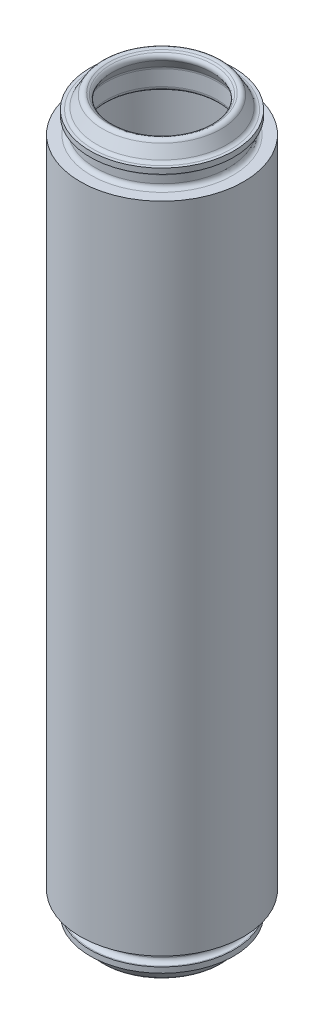
ISO-10303-21;
HEADER;
FILE_DESCRIPTION(('STEP AP214'),'2;1');
FILE_NAME('part.step','',(''),(''),'','','');
FILE_SCHEMA(('AUTOMOTIVE_DESIGN { 1 0 10303 214 1 1 1 1 }'));
ENDSEC;
DATA;
#1=APPLICATION_CONTEXT('core data for automotive mechanical design processes');
#2=APPLICATION_PROTOCOL_DEFINITION('international standard','automotive_design',2000,#1);
#3=PRODUCT_CONTEXT('',#1,'mechanical');
#4=PRODUCT('Part','Part','',(#3));
#5=PRODUCT_RELATED_PRODUCT_CATEGORY('part','',(#4));
#6=PRODUCT_DEFINITION_FORMATION('','',#4);
#7=PRODUCT_DEFINITION_CONTEXT('part definition',#1,'design');
#8=PRODUCT_DEFINITION('design','',#6,#7);
#9=PRODUCT_DEFINITION_SHAPE('','',#8);
#10=(LENGTH_UNIT() NAMED_UNIT(*) SI_UNIT(.MILLI.,.METRE.));
#11=(NAMED_UNIT(*) PLANE_ANGLE_UNIT() SI_UNIT($,.RADIAN.));
#12=(NAMED_UNIT(*) SI_UNIT($,.STERADIAN.) SOLID_ANGLE_UNIT());
#13=UNCERTAINTY_MEASURE_WITH_UNIT(LENGTH_MEASURE(1.E-05),#10,'distance_accuracy_value','');
#14=(GEOMETRIC_REPRESENTATION_CONTEXT(3) GLOBAL_UNCERTAINTY_ASSIGNED_CONTEXT((#13)) GLOBAL_UNIT_ASSIGNED_CONTEXT((#10,
#11,#12)) REPRESENTATION_CONTEXT('',''));
#15=CARTESIAN_POINT('',(0.,0.,0.));
#16=DIRECTION('',(0.,0.,1.));
#17=DIRECTION('',(1.,0.,0.));
#18=AXIS2_PLACEMENT_3D('',#15,#16,#17);
#19=CARTESIAN_POINT('',(0.,30.,0.));
#20=DIRECTION('',(0.,-1.,0.));
#21=DIRECTION('',(0.,0.,-1.));
#22=AXIS2_PLACEMENT_3D('',#19,#20,#21);
#23=CYLINDRICAL_SURFACE('',#22,7.5);
#24=CARTESIAN_POINT('',(0.,30.,0.));
#25=DIRECTION('',(0.,1.,0.));
#26=DIRECTION('',(0.,0.,1.));
#27=AXIS2_PLACEMENT_3D('',#24,#25,#26);
#28=CIRCLE('',#27,7.5);
#29=CARTESIAN_POINT('',(0.,30.,7.5));
#30=VERTEX_POINT('',#29);
#31=EDGE_CURVE('E50',#30,#30,#28,.T.);
#32=ORIENTED_EDGE('',*,*,#31,.F.);
#33=EDGE_LOOP('',(#32));
#34=FACE_BOUND('',#33,.T.);
#35=CARTESIAN_POINT('',(0.,-30.,0.));
#36=DIRECTION('',(0.,1.,0.));
#37=DIRECTION('',(0.,0.,1.));
#38=AXIS2_PLACEMENT_3D('',#35,#36,#37);
#39=CIRCLE('',#38,7.5);
#40=CARTESIAN_POINT('',(0.,-30.,7.5));
#41=VERTEX_POINT('',#40);
#42=EDGE_CURVE('E126',#41,#41,#39,.T.);
#43=ORIENTED_EDGE('',*,*,#42,.T.);
#44=EDGE_LOOP('',(#43));
#45=FACE_BOUND('',#44,.T.);
#46=ADVANCED_FACE('F43',(#34,#45),#23,.T.);
#47=CARTESIAN_POINT('',(0.,30.,0.));
#48=DIRECTION('',(0.,1.,0.));
#49=DIRECTION('',(0.,0.,1.));
#50=AXIS2_PLACEMENT_3D('',#47,#48,#49);
#51=PLANE('',#50);
#52=CARTESIAN_POINT('',(0.,30.,0.));
#53=DIRECTION('',(0.,1.,0.));
#54=DIRECTION('',(0.,0.,1.));
#55=AXIS2_PLACEMENT_3D('',#52,#53,#54);
#56=CIRCLE('',#55,6.5);
#57=CARTESIAN_POINT('',(0.,30.,6.5));
#58=VERTEX_POINT('',#57);
#59=EDGE_CURVE('E60',#58,#58,#56,.T.);
#60=ORIENTED_EDGE('',*,*,#59,.F.);
#61=EDGE_LOOP('',(#60));
#62=FACE_BOUND('',#61,.T.);
#63=ORIENTED_EDGE('',*,*,#31,.T.);
#64=EDGE_LOOP('',(#63));
#65=FACE_BOUND('',#64,.T.);
#66=ADVANCED_FACE('F215',(#62,#65),#51,.T.);
#67=CARTESIAN_POINT('',(0.,29.,0.));
#68=DIRECTION('',(0.,-1.,0.));
#69=DIRECTION('',(0.,0.,-1.));
#70=AXIS2_PLACEMENT_3D('',#67,#68,#69);
#71=CONICAL_SURFACE('',#70,6.5,0.950546840812074);
#72=CARTESIAN_POINT('',(0.,29.880353769634,0.));
#73=DIRECTION('',(0.,-1.,0.));
#74=DIRECTION('',(0.,0.,-1.));
#75=AXIS2_PLACEMENT_3D('',#72,#73,#74);
#76=CIRCLE('',#75,5.26750472251236);
#77=CARTESIAN_POINT('',(0.,29.880353769634,-5.26750472251236));
#78=VERTEX_POINT('',#77);
#79=EDGE_CURVE('E65',#78,#78,#76,.T.);
#80=ORIENTED_EDGE('',*,*,#79,.F.);
#81=EDGE_LOOP('',(#80));
#82=FACE_BOUND('',#81,.T.);
#83=CARTESIAN_POINT('',(0.,29.,0.));
#84=DIRECTION('',(0.,-1.,0.));
#85=DIRECTION('',(0.,0.,-1.));
#86=AXIS2_PLACEMENT_3D('',#83,#84,#85);
#87=CIRCLE('',#86,6.5);
#88=CARTESIAN_POINT('',(0.,29.,-6.5));
#89=VERTEX_POINT('',#88);
#90=EDGE_CURVE('E10',#89,#89,#87,.T.);
#91=ORIENTED_EDGE('',*,*,#90,.T.);
#92=EDGE_LOOP('',(#91));
#93=FACE_BOUND('',#92,.T.);
#94=ADVANCED_FACE('F221',(#82,#93),#71,.F.);
#95=CARTESIAN_POINT('',(0.,30.2058471581167,0.));
#96=DIRECTION('',(0.,-1.,0.));
#97=DIRECTION('',(0.,0.,-1.));
#98=AXIS2_PLACEMENT_3D('',#95,#96,#97);
#99=TOROIDAL_SURFACE('',#98,5.5,0.4);
#100=CARTESIAN_POINT('',(0.,30.2058471581167,0.));
#101=DIRECTION('',(0.,-1.,0.));
#102=DIRECTION('',(0.,0.,-1.));
#103=AXIS2_PLACEMENT_3D('',#100,#101,#102);
#104=CIRCLE('',#103,5.1);
#105=CARTESIAN_POINT('',(0.,30.2058471581167,-5.1));
#106=VERTEX_POINT('',#105);
#107=EDGE_CURVE('E70',#106,#106,#104,.T.);
#108=ORIENTED_EDGE('',*,*,#107,.F.);
#109=EDGE_LOOP('',(#108));
#110=FACE_BOUND('',#109,.T.);
#111=ORIENTED_EDGE('',*,*,#79,.T.);
#112=EDGE_LOOP('',(#111));
#113=FACE_BOUND('',#112,.T.);
#114=ADVANCED_FACE('F227',(#110,#113),#99,.T.);
#115=CARTESIAN_POINT('',(0.,21.5,0.));
#116=DIRECTION('',(0.,-1.,0.));
#117=DIRECTION('',(0.,0.,-1.));
#118=AXIS2_PLACEMENT_3D('',#115,#116,#117);
#119=CYLINDRICAL_SURFACE('',#118,5.1);
#120=CARTESIAN_POINT('',(0.,31.6248711305964,0.));
#121=DIRECTION('',(0.,-1.,0.));
#122=DIRECTION('',(0.,0.,-1.));
#123=AXIS2_PLACEMENT_3D('',#120,#121,#122);
#124=CIRCLE('',#123,5.1);
#125=CARTESIAN_POINT('',(0.,31.6248711305964,-5.1));
#126=VERTEX_POINT('',#125);
#127=EDGE_CURVE('E74',#126,#126,#124,.T.);
#128=ORIENTED_EDGE('',*,*,#127,.F.);
#129=EDGE_LOOP('',(#128));
#130=FACE_BOUND('',#129,.T.);
#131=ORIENTED_EDGE('',*,*,#107,.T.);
#132=EDGE_LOOP('',(#131));
#133=FACE_BOUND('',#132,.T.);
#134=ADVANCED_FACE('F240',(#130,#133),#119,.F.);
#135=CARTESIAN_POINT('',(0.,31.6248711305964,0.));
#136=DIRECTION('',(0.,-1.,0.));
#137=DIRECTION('',(0.,0.,-1.));
#138=AXIS2_PLACEMENT_3D('',#135,#136,#137);
#139=TOROIDAL_SURFACE('',#138,4.7,0.399999999999998);
#140=CARTESIAN_POINT('',(0.,31.8248711305964,0.));
#141=DIRECTION('',(0.,-1.,0.));
#142=DIRECTION('',(0.,0.,-1.));
#143=AXIS2_PLACEMENT_3D('',#140,#141,#142);
#144=CIRCLE('',#143,5.04641016151377);
#145=CARTESIAN_POINT('',(0.,31.8248711305964,-5.04641016151377));
#146=VERTEX_POINT('',#145);
#147=EDGE_CURVE('E78',#146,#146,#144,.T.);
#148=ORIENTED_EDGE('',*,*,#147,.F.);
#149=EDGE_LOOP('',(#148));
#150=FACE_BOUND('',#149,.T.);
#151=ORIENTED_EDGE('',*,*,#127,.T.);
#152=EDGE_LOOP('',(#151));
#153=FACE_BOUND('',#152,.T.);
#154=ADVANCED_FACE('F244',(#150,#153),#139,.F.);
#155=CARTESIAN_POINT('',(0.,31.8248711305964,0.));
#156=DIRECTION('',(0.,-1.,0.));
#157=DIRECTION('',(0.,0.,-1.));
#158=AXIS2_PLACEMENT_3D('',#155,#156,#157);
#159=CONICAL_SURFACE('',#158,5.04641016151377,0.523598775598291);
#160=CARTESIAN_POINT('',(0.,32.6535898384862,0.));
#161=DIRECTION('',(0.,-1.,0.));
#162=DIRECTION('',(0.,0.,-1.));
#163=AXIS2_PLACEMENT_3D('',#160,#161,#162);
#164=CIRCLE('',#163,4.56794919243113);
#165=CARTESIAN_POINT('',(0.,32.6535898384862,-4.56794919243113));
#166=VERTEX_POINT('',#165);
#167=EDGE_CURVE('E82',#166,#166,#164,.T.);
#168=ORIENTED_EDGE('',*,*,#167,.F.);
#169=EDGE_LOOP('',(#168));
#170=FACE_BOUND('',#169,.T.);
#171=ORIENTED_EDGE('',*,*,#147,.T.);
#172=EDGE_LOOP('',(#171));
#173=FACE_BOUND('',#172,.T.);
#174=ADVANCED_FACE('F248',(#170,#173),#159,.F.);
#175=CARTESIAN_POINT('',(0.,32.8535898384862,0.));
#176=DIRECTION('',(0.,-1.,0.));
#177=DIRECTION('',(0.,0.,-1.));
#178=AXIS2_PLACEMENT_3D('',#175,#176,#177);
#179=TOROIDAL_SURFACE('',#178,4.9143593539449,0.399999999999999);
#180=CARTESIAN_POINT('',(0.,33.2,0.));
#181=DIRECTION('',(0.,-1.,0.));
#182=DIRECTION('',(0.,0.,-1.));
#183=AXIS2_PLACEMENT_3D('',#180,#181,#182);
#184=CIRCLE('',#183,4.71435935394491);
#185=CARTESIAN_POINT('',(0.,33.2,-4.71435935394491));
#186=VERTEX_POINT('',#185);
#187=EDGE_CURVE('E86',#186,#186,#184,.T.);
#188=ORIENTED_EDGE('',*,*,#187,.F.);
#189=EDGE_LOOP('',(#188));
#190=FACE_BOUND('',#189,.T.);
#191=ORIENTED_EDGE('',*,*,#167,.T.);
#192=EDGE_LOOP('',(#191));
#193=FACE_BOUND('',#192,.T.);
#194=ADVANCED_FACE('F252',(#190,#193),#179,.T.);
#195=CARTESIAN_POINT('',(0.,33.2,0.));
#196=DIRECTION('',(0.,1.,0.));
#197=DIRECTION('',(0.,0.,1.));
#198=AXIS2_PLACEMENT_3D('',#195,#196,#197);
#199=CONICAL_SURFACE('',#198,4.71435935394491,1.04719755119661);
#200=CARTESIAN_POINT('',(0.,33.3,0.));
#201=DIRECTION('',(0.,-1.,0.));
#202=DIRECTION('',(0.,0.,-1.));
#203=AXIS2_PLACEMENT_3D('',#200,#201,#202);
#204=CIRCLE('',#203,4.88756443470179);
#205=CARTESIAN_POINT('',(0.,33.3,-4.88756443470179));
#206=VERTEX_POINT('',#205);
#207=EDGE_CURVE('E90',#206,#206,#204,.T.);
#208=ORIENTED_EDGE('',*,*,#207,.F.);
#209=EDGE_LOOP('',(#208));
#210=FACE_BOUND('',#209,.T.);
#211=ORIENTED_EDGE('',*,*,#187,.T.);
#212=EDGE_LOOP('',(#211));
#213=FACE_BOUND('',#212,.T.);
#214=ADVANCED_FACE('F256',(#210,#213),#199,.F.);
#215=CARTESIAN_POINT('',(0.,32.9535898384862,0.));
#216=DIRECTION('',(0.,-1.,0.));
#217=DIRECTION('',(0.,0.,-1.));
#218=AXIS2_PLACEMENT_3D('',#215,#216,#217);
#219=TOROIDAL_SURFACE('',#218,5.08756443470179,0.399999999999998);
#220=CARTESIAN_POINT('',(0.,33.1535898384862,0.));
#221=DIRECTION('',(0.,-1.,0.));
#222=DIRECTION('',(0.,0.,-1.));
#223=AXIS2_PLACEMENT_3D('',#220,#221,#222);
#224=CIRCLE('',#223,5.43397459621557);
#225=CARTESIAN_POINT('',(0.,33.1535898384862,-5.43397459621557));
#226=VERTEX_POINT('',#225);
#227=EDGE_CURVE('E94',#226,#226,#224,.T.);
#228=ORIENTED_EDGE('',*,*,#227,.F.);
#229=EDGE_LOOP('',(#228));
#230=FACE_BOUND('',#229,.T.);
#231=ORIENTED_EDGE('',*,*,#207,.T.);
#232=EDGE_LOOP('',(#231));
#233=FACE_BOUND('',#232,.T.);
#234=ADVANCED_FACE('F260',(#230,#233),#219,.T.);
#235=CARTESIAN_POINT('',(0.,33.1535898384862,0.));
#236=DIRECTION('',(0.,-1.,0.));
#237=DIRECTION('',(0.,0.,-1.));
#238=AXIS2_PLACEMENT_3D('',#235,#236,#237);
#239=CONICAL_SURFACE('',#238,5.43397459621557,0.523598775598298);
#240=CARTESIAN_POINT('',(0.,32.2,0.));
#241=DIRECTION('',(0.,-1.,0.));
#242=DIRECTION('',(0.,0.,-1.));
#243=AXIS2_PLACEMENT_3D('',#240,#241,#242);
#244=CIRCLE('',#243,5.98452994616208);
#245=CARTESIAN_POINT('',(0.,32.2,-5.98452994616208));
#246=VERTEX_POINT('',#245);
#247=EDGE_CURVE('E98',#246,#246,#244,.T.);
#248=ORIENTED_EDGE('',*,*,#247,.F.);
#249=EDGE_LOOP('',(#248));
#250=FACE_BOUND('',#249,.T.);
#251=ORIENTED_EDGE('',*,*,#227,.T.);
#252=EDGE_LOOP('',(#251));
#253=FACE_BOUND('',#252,.T.);
#254=ADVANCED_FACE('F264',(#250,#253),#239,.T.);
#255=CARTESIAN_POINT('',(0.,32.4,0.));
#256=DIRECTION('',(0.,-1.,0.));
#257=DIRECTION('',(0.,0.,-1.));
#258=AXIS2_PLACEMENT_3D('',#255,#256,#257);
#259=TOROIDAL_SURFACE('',#258,6.33094010767586,0.399999999999998);
#260=CARTESIAN_POINT('',(0.,32.,0.));
#261=DIRECTION('',(0.,-1.,0.));
#262=DIRECTION('',(0.,0.,-1.));
#263=AXIS2_PLACEMENT_3D('',#260,#261,#262);
#264=CIRCLE('',#263,6.33094010767586);
#265=CARTESIAN_POINT('',(0.,32.,-6.33094010767586));
#266=VERTEX_POINT('',#265);
#267=EDGE_CURVE('E102',#266,#266,#264,.T.);
#268=ORIENTED_EDGE('',*,*,#267,.F.);
#269=EDGE_LOOP('',(#268));
#270=FACE_BOUND('',#269,.T.);
#271=ORIENTED_EDGE('',*,*,#247,.T.);
#272=EDGE_LOOP('',(#271));
#273=FACE_BOUND('',#272,.T.);
#274=ADVANCED_FACE('F268',(#270,#273),#259,.F.);
#275=CARTESIAN_POINT('',(-6.6,32.,0.));
#276=DIRECTION('',(0.,-1.,0.));
#277=DIRECTION('',(0.,0.,-1.));
#278=AXIS2_PLACEMENT_3D('',#275,#276,#277);
#279=PLANE('',#278);
#280=CARTESIAN_POINT('',(0.,32.,0.));
#281=DIRECTION('',(0.,-1.,0.));
#282=DIRECTION('',(0.,0.,-1.));
#283=AXIS2_PLACEMENT_3D('',#280,#281,#282);
#284=CIRCLE('',#283,6.6);
#285=CARTESIAN_POINT('',(0.,32.,-6.6));
#286=VERTEX_POINT('',#285);
#287=EDGE_CURVE('E106',#286,#286,#284,.T.);
#288=ORIENTED_EDGE('',*,*,#287,.F.);
#289=EDGE_LOOP('',(#288));
#290=FACE_BOUND('',#289,.T.);
#291=ORIENTED_EDGE('',*,*,#267,.T.);
#292=EDGE_LOOP('',(#291));
#293=FACE_BOUND('',#292,.T.);
#294=ADVANCED_FACE('F272',(#290,#293),#279,.F.);
#295=CARTESIAN_POINT('',(0.,21.5,0.));
#296=DIRECTION('',(0.,-1.,0.));
#297=DIRECTION('',(0.,0.,-1.));
#298=AXIS2_PLACEMENT_3D('',#295,#296,#297);
#299=CYLINDRICAL_SURFACE('',#298,6.6);
#300=CARTESIAN_POINT('',(0.,31.5,0.));
#301=DIRECTION('',(0.,-1.,0.));
#302=DIRECTION('',(0.,0.,-1.));
#303=AXIS2_PLACEMENT_3D('',#300,#301,#302);
#304=CIRCLE('',#303,6.6);
#305=CARTESIAN_POINT('',(0.,31.5,-6.6));
#306=VERTEX_POINT('',#305);
#307=EDGE_CURVE('E110',#306,#306,#304,.T.);
#308=ORIENTED_EDGE('',*,*,#307,.F.);
#309=EDGE_LOOP('',(#308));
#310=FACE_BOUND('',#309,.T.);
#311=ORIENTED_EDGE('',*,*,#287,.T.);
#312=EDGE_LOOP('',(#311));
#313=FACE_BOUND('',#312,.T.);
#314=ADVANCED_FACE('F276',(#310,#313),#299,.T.);
#315=CARTESIAN_POINT('',(-6.5,31.5,0.));
#316=DIRECTION('',(0.,1.,0.));
#317=DIRECTION('',(0.,0.,1.));
#318=AXIS2_PLACEMENT_3D('',#315,#316,#317);
#319=PLANE('',#318);
#320=CARTESIAN_POINT('',(0.,31.5,0.));
#321=DIRECTION('',(0.,-1.,0.));
#322=DIRECTION('',(0.,0.,-1.));
#323=AXIS2_PLACEMENT_3D('',#320,#321,#322);
#324=CIRCLE('',#323,6.5);
#325=CARTESIAN_POINT('',(0.,31.5,-6.5));
#326=VERTEX_POINT('',#325);
#327=EDGE_CURVE('E114',#326,#326,#324,.T.);
#328=ORIENTED_EDGE('',*,*,#327,.F.);
#329=EDGE_LOOP('',(#328));
#330=FACE_BOUND('',#329,.T.);
#331=ORIENTED_EDGE('',*,*,#307,.T.);
#332=EDGE_LOOP('',(#331));
#333=FACE_BOUND('',#332,.T.);
#334=ADVANCED_FACE('F280',(#330,#333),#319,.F.);
#335=CARTESIAN_POINT('',(0.,31.1,0.));
#336=DIRECTION('',(0.,-1.,0.));
#337=DIRECTION('',(0.,0.,-1.));
#338=AXIS2_PLACEMENT_3D('',#335,#336,#337);
#339=TOROIDAL_SURFACE('',#338,6.5,0.400000000000001);
#340=CARTESIAN_POINT('',(0.,31.1,0.));
#341=DIRECTION('',(0.,-1.,0.));
#342=DIRECTION('',(0.,0.,-1.));
#343=AXIS2_PLACEMENT_3D('',#340,#341,#342);
#344=CIRCLE('',#343,6.1);
#345=CARTESIAN_POINT('',(0.,31.1,-6.1));
#346=VERTEX_POINT('',#345);
#347=EDGE_CURVE('E118',#346,#346,#344,.T.);
#348=ORIENTED_EDGE('',*,*,#347,.F.);
#349=EDGE_LOOP('',(#348));
#350=FACE_BOUND('',#349,.T.);
#351=ORIENTED_EDGE('',*,*,#327,.T.);
#352=EDGE_LOOP('',(#351));
#353=FACE_BOUND('',#352,.T.);
#354=ADVANCED_FACE('F284',(#350,#353),#339,.F.);
#355=CARTESIAN_POINT('',(0.,21.5,0.));
#356=DIRECTION('',(0.,-1.,0.));
#357=DIRECTION('',(0.,0.,-1.));
#358=AXIS2_PLACEMENT_3D('',#355,#356,#357);
#359=CYLINDRICAL_SURFACE('',#358,6.1);
#360=CARTESIAN_POINT('',(0.,30.4,0.));
#361=DIRECTION('',(0.,-1.,0.));
#362=DIRECTION('',(0.,0.,-1.));
#363=AXIS2_PLACEMENT_3D('',#360,#361,#362);
#364=CIRCLE('',#363,6.1);
#365=CARTESIAN_POINT('',(0.,30.4,-6.1));
#366=VERTEX_POINT('',#365);
#367=EDGE_CURVE('E122',#366,#366,#364,.T.);
#368=ORIENTED_EDGE('',*,*,#367,.F.);
#369=EDGE_LOOP('',(#368));
#370=FACE_BOUND('',#369,.T.);
#371=ORIENTED_EDGE('',*,*,#347,.T.);
#372=EDGE_LOOP('',(#371));
#373=FACE_BOUND('',#372,.T.);
#374=ADVANCED_FACE('F288',(#370,#373),#359,.T.);
#375=CARTESIAN_POINT('',(0.,30.4,0.));
#376=DIRECTION('',(0.,-1.,0.));
#377=DIRECTION('',(0.,0.,-1.));
#378=AXIS2_PLACEMENT_3D('',#375,#376,#377);
#379=TOROIDAL_SURFACE('',#378,6.5,0.400000000000001);
#380=ORIENTED_EDGE('',*,*,#59,.T.);
#381=EDGE_LOOP('',(#380));
#382=FACE_BOUND('',#381,.T.);
#383=ORIENTED_EDGE('',*,*,#367,.T.);
#384=EDGE_LOOP('',(#383));
#385=FACE_BOUND('',#384,.T.);
#386=ADVANCED_FACE('F235',(#382,#385),#379,.F.);
#387=CARTESIAN_POINT('',(0.,21.5,0.));
#388=DIRECTION('',(0.,1.,0.));
#389=DIRECTION('',(0.,0.,1.));
#390=AXIS2_PLACEMENT_3D('',#387,#388,#389);
#391=PLANE('',#390);
#392=CARTESIAN_POINT('',(0.,21.5,0.));
#393=DIRECTION('',(0.,1.,0.));
#394=DIRECTION('',(0.,0.,1.));
#395=AXIS2_PLACEMENT_3D('',#392,#393,#394);
#396=CIRCLE('',#395,6.5);
#397=CARTESIAN_POINT('',(0.,21.5,6.5));
#398=VERTEX_POINT('',#397);
#399=EDGE_CURVE('E55',#398,#398,#396,.T.);
#400=ORIENTED_EDGE('',*,*,#399,.T.);
#401=EDGE_LOOP('',(#400));
#402=FACE_BOUND('',#401,.T.);
#403=ADVANCED_FACE('F233',(#402),#391,.T.);
#404=CARTESIAN_POINT('',(0.,21.5,0.));
#405=DIRECTION('',(0.,1.,0.));
#406=DIRECTION('',(0.,0.,1.));
#407=AXIS2_PLACEMENT_3D('',#404,#405,#406);
#408=CYLINDRICAL_SURFACE('',#407,6.5);
#409=ORIENTED_EDGE('',*,*,#399,.F.);
#410=EDGE_LOOP('',(#409));
#411=FACE_BOUND('',#410,.T.);
#412=ORIENTED_EDGE('',*,*,#90,.F.);
#413=EDGE_LOOP('',(#412));
#414=FACE_BOUND('',#413,.T.);
#415=ADVANCED_FACE('F210',(#411,#414),#408,.F.);
#416=CARTESIAN_POINT('',(0.,-30.,0.));
#417=DIRECTION('',(0.,-1.,0.));
#418=DIRECTION('',(0.,0.,1.));
#419=AXIS2_PLACEMENT_3D('',#416,#417,#418);
#420=PLANE('',#419);
#421=CARTESIAN_POINT('',(0.,-30.,0.));
#422=DIRECTION('',(0.,-1.,0.));
#423=DIRECTION('',(0.,0.,-1.));
#424=AXIS2_PLACEMENT_3D('',#421,#422,#423);
#425=CIRCLE('',#424,6.5);
#426=CARTESIAN_POINT('',(0.,-30.,-6.5));
#427=VERTEX_POINT('',#426);
#428=EDGE_CURVE('E198',#427,#427,#425,.T.);
#429=ORIENTED_EDGE('',*,*,#428,.F.);
#430=EDGE_LOOP('',(#429));
#431=FACE_BOUND('',#430,.T.);
#432=ORIENTED_EDGE('',*,*,#42,.F.);
#433=EDGE_LOOP('',(#432));
#434=FACE_BOUND('',#433,.T.);
#435=ADVANCED_FACE('F206',(#431,#434),#420,.T.);
#436=CARTESIAN_POINT('',(0.,-29.,0.));
#437=DIRECTION('',(0.,1.,0.));
#438=DIRECTION('',(0.,0.,-1.));
#439=AXIS2_PLACEMENT_3D('',#436,#437,#438);
#440=CONICAL_SURFACE('',#439,6.5,0.950546840812074);
#441=CARTESIAN_POINT('',(0.,-29.880353769634,0.));
#442=DIRECTION('',(0.,-1.,0.));
#443=DIRECTION('',(0.,0.,-1.));
#444=AXIS2_PLACEMENT_3D('',#441,#442,#443);
#445=CIRCLE('',#444,5.26750472251236);
#446=CARTESIAN_POINT('',(0.,-29.880353769634,-5.26750472251236));
#447=VERTEX_POINT('',#446);
#448=EDGE_CURVE('E138',#447,#447,#445,.T.);
#449=ORIENTED_EDGE('',*,*,#448,.T.);
#450=EDGE_LOOP('',(#449));
#451=FACE_BOUND('',#450,.T.);
#452=CARTESIAN_POINT('',(0.,-29.,0.));
#453=DIRECTION('',(0.,-1.,0.));
#454=DIRECTION('',(0.,0.,-1.));
#455=AXIS2_PLACEMENT_3D('',#452,#453,#454);
#456=CIRCLE('',#455,6.5);
#457=CARTESIAN_POINT('',(0.,-29.,-6.5));
#458=VERTEX_POINT('',#457);
#459=EDGE_CURVE('E134',#458,#458,#456,.T.);
#460=ORIENTED_EDGE('',*,*,#459,.F.);
#461=EDGE_LOOP('',(#460));
#462=FACE_BOUND('',#461,.T.);
#463=ADVANCED_FACE('F209',(#451,#462),#440,.F.);
#464=CARTESIAN_POINT('',(0.,-30.2058471581167,0.));
#465=DIRECTION('',(0.,1.,0.));
#466=DIRECTION('',(0.,0.,-1.));
#467=AXIS2_PLACEMENT_3D('',#464,#465,#466);
#468=TOROIDAL_SURFACE('',#467,5.5,0.4);
#469=CARTESIAN_POINT('',(0.,-30.2058471581167,0.));
#470=DIRECTION('',(0.,-1.,0.));
#471=DIRECTION('',(0.,0.,-1.));
#472=AXIS2_PLACEMENT_3D('',#469,#470,#471);
#473=CIRCLE('',#472,5.1);
#474=CARTESIAN_POINT('',(0.,-30.2058471581167,-5.1));
#475=VERTEX_POINT('',#474);
#476=EDGE_CURVE('E142',#475,#475,#473,.T.);
#477=ORIENTED_EDGE('',*,*,#476,.T.);
#478=EDGE_LOOP('',(#477));
#479=FACE_BOUND('',#478,.T.);
#480=ORIENTED_EDGE('',*,*,#448,.F.);
#481=EDGE_LOOP('',(#480));
#482=FACE_BOUND('',#481,.T.);
#483=ADVANCED_FACE('F306',(#479,#482),#468,.T.);
#484=CARTESIAN_POINT('',(0.,-21.5,0.));
#485=DIRECTION('',(0.,1.,0.));
#486=DIRECTION('',(0.,0.,-1.));
#487=AXIS2_PLACEMENT_3D('',#484,#485,#486);
#488=CYLINDRICAL_SURFACE('',#487,5.1);
#489=CARTESIAN_POINT('',(0.,-31.6248711305964,0.));
#490=DIRECTION('',(0.,-1.,0.));
#491=DIRECTION('',(0.,0.,-1.));
#492=AXIS2_PLACEMENT_3D('',#489,#490,#491);
#493=CIRCLE('',#492,5.1);
#494=CARTESIAN_POINT('',(0.,-31.6248711305964,-5.1));
#495=VERTEX_POINT('',#494);
#496=EDGE_CURVE('E146',#495,#495,#493,.T.);
#497=ORIENTED_EDGE('',*,*,#496,.T.);
#498=EDGE_LOOP('',(#497));
#499=FACE_BOUND('',#498,.T.);
#500=ORIENTED_EDGE('',*,*,#476,.F.);
#501=EDGE_LOOP('',(#500));
#502=FACE_BOUND('',#501,.T.);
#503=ADVANCED_FACE('F310',(#499,#502),#488,.F.);
#504=CARTESIAN_POINT('',(0.,-31.6248711305964,0.));
#505=DIRECTION('',(0.,1.,0.));
#506=DIRECTION('',(0.,0.,-1.));
#507=AXIS2_PLACEMENT_3D('',#504,#505,#506);
#508=TOROIDAL_SURFACE('',#507,4.7,0.399999999999998);
#509=CARTESIAN_POINT('',(0.,-31.8248711305964,0.));
#510=DIRECTION('',(0.,-1.,0.));
#511=DIRECTION('',(0.,0.,-1.));
#512=AXIS2_PLACEMENT_3D('',#509,#510,#511);
#513=CIRCLE('',#512,5.04641016151377);
#514=CARTESIAN_POINT('',(0.,-31.8248711305964,-5.04641016151377));
#515=VERTEX_POINT('',#514);
#516=EDGE_CURVE('E150',#515,#515,#513,.T.);
#517=ORIENTED_EDGE('',*,*,#516,.T.);
#518=EDGE_LOOP('',(#517));
#519=FACE_BOUND('',#518,.T.);
#520=ORIENTED_EDGE('',*,*,#496,.F.);
#521=EDGE_LOOP('',(#520));
#522=FACE_BOUND('',#521,.T.);
#523=ADVANCED_FACE('F314',(#519,#522),#508,.F.);
#524=CARTESIAN_POINT('',(0.,-31.8248711305964,0.));
#525=DIRECTION('',(0.,1.,0.));
#526=DIRECTION('',(0.,0.,-1.));
#527=AXIS2_PLACEMENT_3D('',#524,#525,#526);
#528=CONICAL_SURFACE('',#527,5.04641016151377,0.523598775598291);
#529=CARTESIAN_POINT('',(0.,-32.6535898384862,0.));
#530=DIRECTION('',(0.,-1.,0.));
#531=DIRECTION('',(0.,0.,-1.));
#532=AXIS2_PLACEMENT_3D('',#529,#530,#531);
#533=CIRCLE('',#532,4.56794919243113);
#534=CARTESIAN_POINT('',(0.,-32.6535898384862,-4.56794919243113));
#535=VERTEX_POINT('',#534);
#536=EDGE_CURVE('E154',#535,#535,#533,.T.);
#537=ORIENTED_EDGE('',*,*,#536,.T.);
#538=EDGE_LOOP('',(#537));
#539=FACE_BOUND('',#538,.T.);
#540=ORIENTED_EDGE('',*,*,#516,.F.);
#541=EDGE_LOOP('',(#540));
#542=FACE_BOUND('',#541,.T.);
#543=ADVANCED_FACE('F318',(#539,#542),#528,.F.);
#544=CARTESIAN_POINT('',(0.,-32.8535898384862,0.));
#545=DIRECTION('',(0.,1.,0.));
#546=DIRECTION('',(0.,0.,-1.));
#547=AXIS2_PLACEMENT_3D('',#544,#545,#546);
#548=TOROIDAL_SURFACE('',#547,4.9143593539449,0.399999999999999);
#549=CARTESIAN_POINT('',(0.,-33.2,0.));
#550=DIRECTION('',(0.,-1.,0.));
#551=DIRECTION('',(0.,0.,-1.));
#552=AXIS2_PLACEMENT_3D('',#549,#550,#551);
#553=CIRCLE('',#552,4.71435935394491);
#554=CARTESIAN_POINT('',(0.,-33.2,-4.71435935394491));
#555=VERTEX_POINT('',#554);
#556=EDGE_CURVE('E158',#555,#555,#553,.T.);
#557=ORIENTED_EDGE('',*,*,#556,.T.);
#558=EDGE_LOOP('',(#557));
#559=FACE_BOUND('',#558,.T.);
#560=ORIENTED_EDGE('',*,*,#536,.F.);
#561=EDGE_LOOP('',(#560));
#562=FACE_BOUND('',#561,.T.);
#563=ADVANCED_FACE('F322',(#559,#562),#548,.T.);
#564=CARTESIAN_POINT('',(0.,-33.2,0.));
#565=DIRECTION('',(0.,-1.,0.));
#566=DIRECTION('',(0.,0.,1.));
#567=AXIS2_PLACEMENT_3D('',#564,#565,#566);
#568=CONICAL_SURFACE('',#567,4.71435935394491,1.04719755119661);
#569=CARTESIAN_POINT('',(0.,-33.3,0.));
#570=DIRECTION('',(0.,-1.,0.));
#571=DIRECTION('',(0.,0.,-1.));
#572=AXIS2_PLACEMENT_3D('',#569,#570,#571);
#573=CIRCLE('',#572,4.88756443470179);
#574=CARTESIAN_POINT('',(0.,-33.3,-4.88756443470179));
#575=VERTEX_POINT('',#574);
#576=EDGE_CURVE('E162',#575,#575,#573,.T.);
#577=ORIENTED_EDGE('',*,*,#576,.T.);
#578=EDGE_LOOP('',(#577));
#579=FACE_BOUND('',#578,.T.);
#580=ORIENTED_EDGE('',*,*,#556,.F.);
#581=EDGE_LOOP('',(#580));
#582=FACE_BOUND('',#581,.T.);
#583=ADVANCED_FACE('F326',(#579,#582),#568,.F.);
#584=CARTESIAN_POINT('',(0.,-32.9535898384862,0.));
#585=DIRECTION('',(0.,1.,0.));
#586=DIRECTION('',(0.,0.,-1.));
#587=AXIS2_PLACEMENT_3D('',#584,#585,#586);
#588=TOROIDAL_SURFACE('',#587,5.08756443470179,0.399999999999998);
#589=CARTESIAN_POINT('',(0.,-33.1535898384862,0.));
#590=DIRECTION('',(0.,-1.,0.));
#591=DIRECTION('',(0.,0.,-1.));
#592=AXIS2_PLACEMENT_3D('',#589,#590,#591);
#593=CIRCLE('',#592,5.43397459621557);
#594=CARTESIAN_POINT('',(0.,-33.1535898384862,-5.43397459621557));
#595=VERTEX_POINT('',#594);
#596=EDGE_CURVE('E166',#595,#595,#593,.T.);
#597=ORIENTED_EDGE('',*,*,#596,.T.);
#598=EDGE_LOOP('',(#597));
#599=FACE_BOUND('',#598,.T.);
#600=ORIENTED_EDGE('',*,*,#576,.F.);
#601=EDGE_LOOP('',(#600));
#602=FACE_BOUND('',#601,.T.);
#603=ADVANCED_FACE('F330',(#599,#602),#588,.T.);
#604=CARTESIAN_POINT('',(0.,-33.1535898384862,0.));
#605=DIRECTION('',(0.,1.,0.));
#606=DIRECTION('',(0.,0.,-1.));
#607=AXIS2_PLACEMENT_3D('',#604,#605,#606);
#608=CONICAL_SURFACE('',#607,5.43397459621557,0.523598775598298);
#609=CARTESIAN_POINT('',(0.,-32.2,0.));
#610=DIRECTION('',(0.,-1.,0.));
#611=DIRECTION('',(0.,0.,-1.));
#612=AXIS2_PLACEMENT_3D('',#609,#610,#611);
#613=CIRCLE('',#612,5.98452994616208);
#614=CARTESIAN_POINT('',(0.,-32.2,-5.98452994616208));
#615=VERTEX_POINT('',#614);
#616=EDGE_CURVE('E170',#615,#615,#613,.T.);
#617=ORIENTED_EDGE('',*,*,#616,.T.);
#618=EDGE_LOOP('',(#617));
#619=FACE_BOUND('',#618,.T.);
#620=ORIENTED_EDGE('',*,*,#596,.F.);
#621=EDGE_LOOP('',(#620));
#622=FACE_BOUND('',#621,.T.);
#623=ADVANCED_FACE('F334',(#619,#622),#608,.T.);
#624=CARTESIAN_POINT('',(0.,-32.4,0.));
#625=DIRECTION('',(0.,1.,0.));
#626=DIRECTION('',(0.,0.,-1.));
#627=AXIS2_PLACEMENT_3D('',#624,#625,#626);
#628=TOROIDAL_SURFACE('',#627,6.33094010767586,0.399999999999998);
#629=CARTESIAN_POINT('',(0.,-32.,0.));
#630=DIRECTION('',(0.,-1.,0.));
#631=DIRECTION('',(0.,0.,-1.));
#632=AXIS2_PLACEMENT_3D('',#629,#630,#631);
#633=CIRCLE('',#632,6.33094010767586);
#634=CARTESIAN_POINT('',(0.,-32.,-6.33094010767586));
#635=VERTEX_POINT('',#634);
#636=EDGE_CURVE('E174',#635,#635,#633,.T.);
#637=ORIENTED_EDGE('',*,*,#636,.T.);
#638=EDGE_LOOP('',(#637));
#639=FACE_BOUND('',#638,.T.);
#640=ORIENTED_EDGE('',*,*,#616,.F.);
#641=EDGE_LOOP('',(#640));
#642=FACE_BOUND('',#641,.T.);
#643=ADVANCED_FACE('F338',(#639,#642),#628,.F.);
#644=CARTESIAN_POINT('',(-6.6,-32.,0.));
#645=DIRECTION('',(0.,1.,0.));
#646=DIRECTION('',(0.,0.,-1.));
#647=AXIS2_PLACEMENT_3D('',#644,#645,#646);
#648=PLANE('',#647);
#649=CARTESIAN_POINT('',(0.,-32.,0.));
#650=DIRECTION('',(0.,-1.,0.));
#651=DIRECTION('',(0.,0.,-1.));
#652=AXIS2_PLACEMENT_3D('',#649,#650,#651);
#653=CIRCLE('',#652,6.6);
#654=CARTESIAN_POINT('',(0.,-32.,-6.6));
#655=VERTEX_POINT('',#654);
#656=EDGE_CURVE('E178',#655,#655,#653,.T.);
#657=ORIENTED_EDGE('',*,*,#656,.T.);
#658=EDGE_LOOP('',(#657));
#659=FACE_BOUND('',#658,.T.);
#660=ORIENTED_EDGE('',*,*,#636,.F.);
#661=EDGE_LOOP('',(#660));
#662=FACE_BOUND('',#661,.T.);
#663=ADVANCED_FACE('F342',(#659,#662),#648,.F.);
#664=CARTESIAN_POINT('',(0.,-21.5,0.));
#665=DIRECTION('',(0.,1.,0.));
#666=DIRECTION('',(0.,0.,-1.));
#667=AXIS2_PLACEMENT_3D('',#664,#665,#666);
#668=CYLINDRICAL_SURFACE('',#667,6.6);
#669=CARTESIAN_POINT('',(0.,-31.5,0.));
#670=DIRECTION('',(0.,-1.,0.));
#671=DIRECTION('',(0.,0.,-1.));
#672=AXIS2_PLACEMENT_3D('',#669,#670,#671);
#673=CIRCLE('',#672,6.6);
#674=CARTESIAN_POINT('',(0.,-31.5,-6.6));
#675=VERTEX_POINT('',#674);
#676=EDGE_CURVE('E182',#675,#675,#673,.T.);
#677=ORIENTED_EDGE('',*,*,#676,.T.);
#678=EDGE_LOOP('',(#677));
#679=FACE_BOUND('',#678,.T.);
#680=ORIENTED_EDGE('',*,*,#656,.F.);
#681=EDGE_LOOP('',(#680));
#682=FACE_BOUND('',#681,.T.);
#683=ADVANCED_FACE('F346',(#679,#682),#668,.T.);
#684=CARTESIAN_POINT('',(-6.5,-31.5,0.));
#685=DIRECTION('',(0.,-1.,0.));
#686=DIRECTION('',(0.,0.,1.));
#687=AXIS2_PLACEMENT_3D('',#684,#685,#686);
#688=PLANE('',#687);
#689=CARTESIAN_POINT('',(0.,-31.5,0.));
#690=DIRECTION('',(0.,-1.,0.));
#691=DIRECTION('',(0.,0.,-1.));
#692=AXIS2_PLACEMENT_3D('',#689,#690,#691);
#693=CIRCLE('',#692,6.5);
#694=CARTESIAN_POINT('',(0.,-31.5,-6.5));
#695=VERTEX_POINT('',#694);
#696=EDGE_CURVE('E186',#695,#695,#693,.T.);
#697=ORIENTED_EDGE('',*,*,#696,.T.);
#698=EDGE_LOOP('',(#697));
#699=FACE_BOUND('',#698,.T.);
#700=ORIENTED_EDGE('',*,*,#676,.F.);
#701=EDGE_LOOP('',(#700));
#702=FACE_BOUND('',#701,.T.);
#703=ADVANCED_FACE('F350',(#699,#702),#688,.F.);
#704=CARTESIAN_POINT('',(0.,-31.1,0.));
#705=DIRECTION('',(0.,1.,0.));
#706=DIRECTION('',(0.,0.,-1.));
#707=AXIS2_PLACEMENT_3D('',#704,#705,#706);
#708=TOROIDAL_SURFACE('',#707,6.5,0.400000000000001);
#709=CARTESIAN_POINT('',(0.,-31.1,0.));
#710=DIRECTION('',(0.,-1.,0.));
#711=DIRECTION('',(0.,0.,-1.));
#712=AXIS2_PLACEMENT_3D('',#709,#710,#711);
#713=CIRCLE('',#712,6.1);
#714=CARTESIAN_POINT('',(0.,-31.1,-6.1));
#715=VERTEX_POINT('',#714);
#716=EDGE_CURVE('E190',#715,#715,#713,.T.);
#717=ORIENTED_EDGE('',*,*,#716,.T.);
#718=EDGE_LOOP('',(#717));
#719=FACE_BOUND('',#718,.T.);
#720=ORIENTED_EDGE('',*,*,#696,.F.);
#721=EDGE_LOOP('',(#720));
#722=FACE_BOUND('',#721,.T.);
#723=ADVANCED_FACE('F354',(#719,#722),#708,.F.);
#724=CARTESIAN_POINT('',(0.,-21.5,0.));
#725=DIRECTION('',(0.,1.,0.));
#726=DIRECTION('',(0.,0.,-1.));
#727=AXIS2_PLACEMENT_3D('',#724,#725,#726);
#728=CYLINDRICAL_SURFACE('',#727,6.1);
#729=CARTESIAN_POINT('',(0.,-30.4,0.));
#730=DIRECTION('',(0.,-1.,0.));
#731=DIRECTION('',(0.,0.,-1.));
#732=AXIS2_PLACEMENT_3D('',#729,#730,#731);
#733=CIRCLE('',#732,6.1);
#734=CARTESIAN_POINT('',(0.,-30.4,-6.1));
#735=VERTEX_POINT('',#734);
#736=EDGE_CURVE('E194',#735,#735,#733,.T.);
#737=ORIENTED_EDGE('',*,*,#736,.T.);
#738=EDGE_LOOP('',(#737));
#739=FACE_BOUND('',#738,.T.);
#740=ORIENTED_EDGE('',*,*,#716,.F.);
#741=EDGE_LOOP('',(#740));
#742=FACE_BOUND('',#741,.T.);
#743=ADVANCED_FACE('F358',(#739,#742),#728,.T.);
#744=CARTESIAN_POINT('',(0.,-30.4,0.));
#745=DIRECTION('',(0.,1.,0.));
#746=DIRECTION('',(0.,0.,-1.));
#747=AXIS2_PLACEMENT_3D('',#744,#745,#746);
#748=TOROIDAL_SURFACE('',#747,6.5,0.400000000000001);
#749=ORIENTED_EDGE('',*,*,#428,.T.);
#750=EDGE_LOOP('',(#749));
#751=FACE_BOUND('',#750,.T.);
#752=ORIENTED_EDGE('',*,*,#736,.F.);
#753=EDGE_LOOP('',(#752));
#754=FACE_BOUND('',#753,.T.);
#755=ADVANCED_FACE('F203',(#751,#754),#748,.F.);
#756=CARTESIAN_POINT('',(0.,-21.5,0.));
#757=DIRECTION('',(0.,-1.,0.));
#758=DIRECTION('',(0.,0.,1.));
#759=AXIS2_PLACEMENT_3D('',#756,#757,#758);
#760=PLANE('',#759);
#761=CARTESIAN_POINT('',(0.,-21.5,0.));
#762=DIRECTION('',(0.,1.,0.));
#763=DIRECTION('',(0.,0.,1.));
#764=AXIS2_PLACEMENT_3D('',#761,#762,#763);
#765=CIRCLE('',#764,6.5);
#766=CARTESIAN_POINT('',(0.,-21.5,6.5));
#767=VERTEX_POINT('',#766);
#768=EDGE_CURVE('E130',#767,#767,#765,.T.);
#769=ORIENTED_EDGE('',*,*,#768,.F.);
#770=EDGE_LOOP('',(#769));
#771=FACE_BOUND('',#770,.T.);
#772=ADVANCED_FACE('F299',(#771),#760,.T.);
#773=CARTESIAN_POINT('',(0.,-21.5,0.));
#774=DIRECTION('',(0.,-1.,0.));
#775=DIRECTION('',(0.,0.,-1.));
#776=AXIS2_PLACEMENT_3D('',#773,#774,#775);
#777=CYLINDRICAL_SURFACE('',#776,6.5);
#778=ORIENTED_EDGE('',*,*,#768,.T.);
#779=EDGE_LOOP('',(#778));
#780=FACE_BOUND('',#779,.T.);
#781=ORIENTED_EDGE('',*,*,#459,.T.);
#782=EDGE_LOOP('',(#781));
#783=FACE_BOUND('',#782,.T.);
#784=ADVANCED_FACE('F296',(#780,#783),#777,.F.);
#785=CLOSED_SHELL('',(#46,#66,#94,#114,#134,#154,#174,#194,#214,#234,#254,#274,#294,#314,#334,
#354,#374,#386,#403,#415,#435,#463,#483,#503,#523,#543,#563,#583,#603,#623,#643,#663,#683,#703,
#723,#743,#755,#772,#784));
#786=MANIFOLD_SOLID_BREP('B2',#785);
#787=ADVANCED_BREP_SHAPE_REPRESENTATION('',(#18,#786),#14);
#788=SHAPE_DEFINITION_REPRESENTATION(#9,#787);
ENDSEC;
END-ISO-10303-21;
